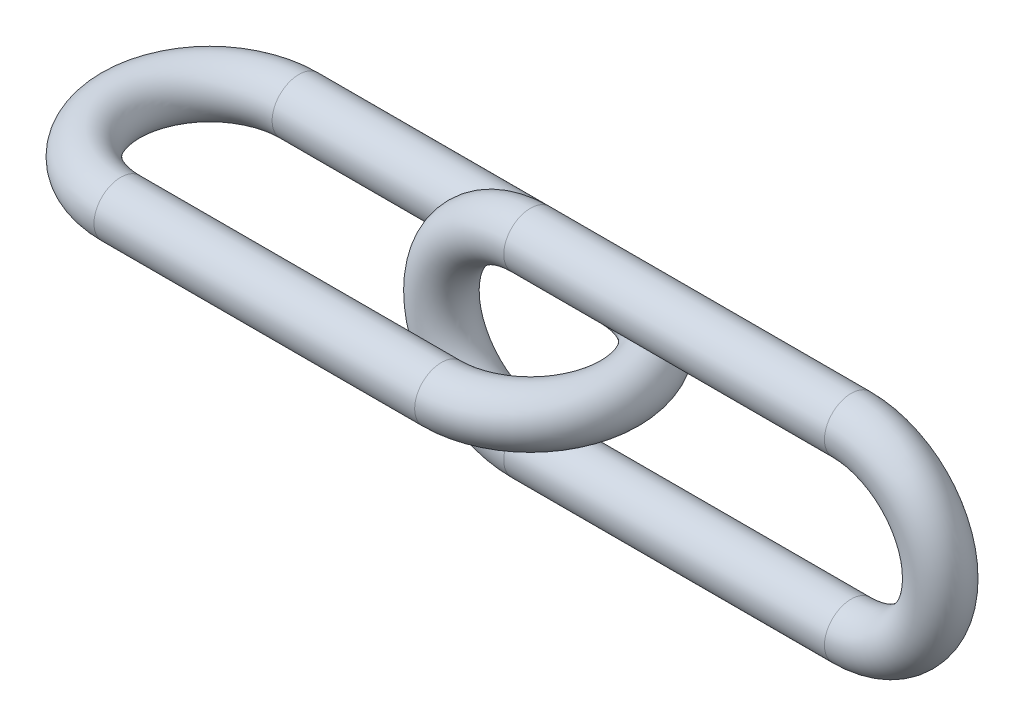
ISO-10303-21;
HEADER;
FILE_DESCRIPTION(('STEP AP214'),'2;1');
FILE_NAME('part.step','',(''),(''),'','','');
FILE_SCHEMA(('AUTOMOTIVE_DESIGN { 1 0 10303 214 1 1 1 1 }'));
ENDSEC;
DATA;
#1=APPLICATION_CONTEXT('core data for automotive mechanical design processes');
#2=APPLICATION_PROTOCOL_DEFINITION('international standard','automotive_design',2000,#1);
#3=PRODUCT_CONTEXT('',#1,'mechanical');
#4=PRODUCT('Part','Part','',(#3));
#5=PRODUCT_RELATED_PRODUCT_CATEGORY('part','',(#4));
#6=PRODUCT_DEFINITION_FORMATION('','',#4);
#7=PRODUCT_DEFINITION_CONTEXT('part definition',#1,'design');
#8=PRODUCT_DEFINITION('design','',#6,#7);
#9=PRODUCT_DEFINITION_SHAPE('','',#8);
#10=(LENGTH_UNIT() NAMED_UNIT(*) SI_UNIT(.MILLI.,.METRE.));
#11=(NAMED_UNIT(*) PLANE_ANGLE_UNIT() SI_UNIT($,.RADIAN.));
#12=(NAMED_UNIT(*) SI_UNIT($,.STERADIAN.) SOLID_ANGLE_UNIT());
#13=UNCERTAINTY_MEASURE_WITH_UNIT(LENGTH_MEASURE(1.E-05),#10,'distance_accuracy_value','');
#14=(GEOMETRIC_REPRESENTATION_CONTEXT(3) GLOBAL_UNCERTAINTY_ASSIGNED_CONTEXT((#13)) GLOBAL_UNIT_ASSIGNED_CONTEXT((#10,
#11,#12)) REPRESENTATION_CONTEXT('',''));
#15=CARTESIAN_POINT('',(0.,0.,0.));
#16=DIRECTION('',(0.,0.,1.));
#17=DIRECTION('',(1.,0.,0.));
#18=AXIS2_PLACEMENT_3D('',#15,#16,#17);
#19=CARTESIAN_POINT('',(-222.426406871193,0.,-50.));
#20=DIRECTION('',(1.,0.,0.));
#21=DIRECTION('',(0.,0.,-1.));
#22=AXIS2_PLACEMENT_3D('',#19,#20,#21);
#23=CYLINDRICAL_SURFACE('',#22,15.);
#24=CARTESIAN_POINT('',(-180.,0.,-50.));
#25=DIRECTION('',(1.,0.,0.));
#26=DIRECTION('',(0.,0.,-1.));
#27=AXIS2_PLACEMENT_3D('',#24,#25,#26);
#28=CIRCLE('',#27,15.);
#29=CARTESIAN_POINT('',(-180.,0.,-65.));
#30=VERTEX_POINT('',#29);
#31=EDGE_CURVE('E11',#30,#30,#28,.F.);
#32=ORIENTED_EDGE('',*,*,#31,.F.);
#33=EDGE_LOOP('',(#32));
#34=FACE_BOUND('',#33,.T.);
#35=CARTESIAN_POINT('',(0.,0.,-50.));
#36=DIRECTION('',(1.,0.,0.));
#37=DIRECTION('',(0.,0.,-1.));
#38=AXIS2_PLACEMENT_3D('',#35,#36,#37);
#39=CIRCLE('',#38,15.);
#40=CARTESIAN_POINT('',(0.,0.,-65.));
#41=VERTEX_POINT('',#40);
#42=EDGE_CURVE('E55',#41,#41,#39,.T.);
#43=ORIENTED_EDGE('',*,*,#42,.F.);
#44=EDGE_LOOP('',(#43));
#45=FACE_BOUND('',#44,.T.);
#46=ADVANCED_FACE('F49',(#34,#45),#23,.T.);
#47=CARTESIAN_POINT('',(-180.,0.,0.));
#48=DIRECTION('',(0.,-1.,0.));
#49=DIRECTION('',(0.,0.,-1.));
#50=AXIS2_PLACEMENT_3D('',#47,#48,#49);
#51=TOROIDAL_SURFACE('',#50,50.,15.);
#52=CARTESIAN_POINT('',(-180.,0.,50.));
#53=DIRECTION('',(1.,0.,0.));
#54=DIRECTION('',(0.,0.,-1.));
#55=AXIS2_PLACEMENT_3D('',#52,#53,#54);
#56=CIRCLE('',#55,15.);
#57=CARTESIAN_POINT('',(-180.,0.,65.));
#58=VERTEX_POINT('',#57);
#59=EDGE_CURVE('E59',#58,#58,#56,.T.);
#60=CARTESIAN_POINT('',(-180.,0.,0.));
#61=DIRECTION('',(0.,-1.,0.));
#62=DIRECTION('',(0.,0.,-1.));
#63=AXIS2_PLACEMENT_3D('',#60,#61,#62);
#64=CIRCLE('',#63,65.);
#65=EDGE_CURVE('',#58,#30,#64,.T.);
#66=ORIENTED_EDGE('',*,*,#59,.F.);
#67=ORIENTED_EDGE('',*,*,#31,.T.);
#68=ORIENTED_EDGE('',*,*,#65,.T.);
#69=ORIENTED_EDGE('',*,*,#65,.F.);
#70=EDGE_LOOP('',(#66,#68,#67,#69));
#71=FACE_BOUND('',#70,.T.);
#72=ADVANCED_FACE('F73',(#71),#51,.T.);
#73=CARTESIAN_POINT('',(42.4264068711929,0.,50.));
#74=DIRECTION('',(-1.,0.,0.));
#75=DIRECTION('',(0.,0.,1.));
#76=AXIS2_PLACEMENT_3D('',#73,#74,#75);
#77=CYLINDRICAL_SURFACE('',#76,15.);
#78=ORIENTED_EDGE('',*,*,#59,.T.);
#79=EDGE_LOOP('',(#78));
#80=FACE_BOUND('',#79,.T.);
#81=CARTESIAN_POINT('',(0.,0.,50.));
#82=DIRECTION('',(1.,0.,0.));
#83=DIRECTION('',(0.,0.,-1.));
#84=AXIS2_PLACEMENT_3D('',#81,#82,#83);
#85=CIRCLE('',#84,15.);
#86=CARTESIAN_POINT('',(0.,0.,65.));
#87=VERTEX_POINT('',#86);
#88=EDGE_CURVE('E63',#87,#87,#85,.T.);
#89=ORIENTED_EDGE('',*,*,#88,.F.);
#90=EDGE_LOOP('',(#89));
#91=FACE_BOUND('',#90,.T.);
#92=ADVANCED_FACE('F71',(#80,#91),#77,.T.);
#93=CARTESIAN_POINT('',(0.,0.,0.));
#94=DIRECTION('',(0.,1.,0.));
#95=DIRECTION('',(0.,0.,1.));
#96=AXIS2_PLACEMENT_3D('',#93,#94,#95);
#97=TOROIDAL_SURFACE('',#96,50.,15.);
#98=CARTESIAN_POINT('',(0.,0.,0.));
#99=DIRECTION('',(0.,1.,0.));
#100=DIRECTION('',(0.,0.,1.));
#101=AXIS2_PLACEMENT_3D('',#98,#99,#100);
#102=CIRCLE('',#101,65.);
#103=EDGE_CURVE('',#87,#41,#102,.T.);
#104=ORIENTED_EDGE('',*,*,#88,.T.);
#105=ORIENTED_EDGE('',*,*,#42,.T.);
#106=ORIENTED_EDGE('',*,*,#103,.T.);
#107=ORIENTED_EDGE('',*,*,#103,.F.);
#108=EDGE_LOOP('',(#104,#106,#105,#107));
#109=FACE_BOUND('',#108,.T.);
#110=ADVANCED_FACE('F69',(#109),#97,.T.);
#111=CLOSED_SHELL('',(#46,#72,#92,#110));
#112=MANIFOLD_SOLID_BREP('B2',#111);
#113=CARTESIAN_POINT('',(-42.4264068711929,50.,0.));
#114=DIRECTION('',(1.,0.,0.));
#115=DIRECTION('',(0.,0.,-1.));
#116=AXIS2_PLACEMENT_3D('',#113,#114,#115);
#117=CYLINDRICAL_SURFACE('',#116,15.);
#118=CARTESIAN_POINT('',(0.,50.,0.));
#119=DIRECTION('',(1.,0.,0.));
#120=DIRECTION('',(0.,0.,-1.));
#121=AXIS2_PLACEMENT_3D('',#118,#119,#120);
#122=CIRCLE('',#121,15.);
#123=CARTESIAN_POINT('',(0.,65.,0.));
#124=VERTEX_POINT('',#123);
#125=EDGE_CURVE('E48',#124,#124,#122,.F.);
#126=ORIENTED_EDGE('',*,*,#125,.F.);
#127=EDGE_LOOP('',(#126));
#128=FACE_BOUND('',#127,.T.);
#129=CARTESIAN_POINT('',(180.,50.,0.));
#130=DIRECTION('',(1.,0.,0.));
#131=DIRECTION('',(0.,0.,-1.));
#132=AXIS2_PLACEMENT_3D('',#129,#130,#131);
#133=CIRCLE('',#132,15.);
#134=CARTESIAN_POINT('',(180.,65.,0.));
#135=VERTEX_POINT('',#134);
#136=EDGE_CURVE('E126',#135,#135,#133,.T.);
#137=ORIENTED_EDGE('',*,*,#136,.F.);
#138=EDGE_LOOP('',(#137));
#139=FACE_BOUND('',#138,.T.);
#140=ADVANCED_FACE('F119',(#128,#139),#117,.T.);
#141=CARTESIAN_POINT('',(180.,0.,0.));
#142=DIRECTION('',(0.,0.,1.));
#143=DIRECTION('',(1.,0.,0.));
#144=AXIS2_PLACEMENT_3D('',#141,#142,#143);
#145=TOROIDAL_SURFACE('',#144,50.,15.);
#146=CARTESIAN_POINT('',(180.,-50.,0.));
#147=DIRECTION('',(-1.,0.,0.));
#148=DIRECTION('',(0.,0.,-1.));
#149=AXIS2_PLACEMENT_3D('',#146,#147,#148);
#150=CIRCLE('',#149,15.);
#151=CARTESIAN_POINT('',(180.,-65.,0.));
#152=VERTEX_POINT('',#151);
#153=EDGE_CURVE('E131',#152,#152,#150,.T.);
#154=CARTESIAN_POINT('',(180.,0.,0.));
#155=DIRECTION('',(0.,0.,1.));
#156=DIRECTION('',(1.,0.,0.));
#157=AXIS2_PLACEMENT_3D('',#154,#155,#156);
#158=CIRCLE('',#157,65.);
#159=EDGE_CURVE('',#152,#135,#158,.T.);
#160=ORIENTED_EDGE('',*,*,#153,.F.);
#161=ORIENTED_EDGE('',*,*,#136,.T.);
#162=ORIENTED_EDGE('',*,*,#159,.T.);
#163=ORIENTED_EDGE('',*,*,#159,.F.);
#164=EDGE_LOOP('',(#160,#162,#161,#163));
#165=FACE_BOUND('',#164,.T.);
#166=ADVANCED_FACE('F152',(#165),#145,.T.);
#167=CARTESIAN_POINT('',(222.426406871193,-50.,0.));
#168=DIRECTION('',(-1.,0.,0.));
#169=DIRECTION('',(0.,0.,1.));
#170=AXIS2_PLACEMENT_3D('',#167,#168,#169);
#171=CYLINDRICAL_SURFACE('',#170,15.);
#172=CARTESIAN_POINT('',(0.,-50.,0.));
#173=DIRECTION('',(1.,0.,0.));
#174=DIRECTION('',(0.,0.,-1.));
#175=AXIS2_PLACEMENT_3D('',#172,#173,#174);
#176=CIRCLE('',#175,15.);
#177=CARTESIAN_POINT('',(0.,-65.,0.));
#178=VERTEX_POINT('',#177);
#179=EDGE_CURVE('E136',#178,#178,#176,.T.);
#180=ORIENTED_EDGE('',*,*,#179,.T.);
#181=EDGE_LOOP('',(#180));
#182=FACE_BOUND('',#181,.T.);
#183=ORIENTED_EDGE('',*,*,#153,.T.);
#184=EDGE_LOOP('',(#183));
#185=FACE_BOUND('',#184,.T.);
#186=ADVANCED_FACE('F143',(#182,#185),#171,.T.);
#187=CARTESIAN_POINT('',(0.,0.,0.));
#188=DIRECTION('',(0.,0.,-1.));
#189=DIRECTION('',(-1.,0.,0.));
#190=AXIS2_PLACEMENT_3D('',#187,#188,#189);
#191=TOROIDAL_SURFACE('',#190,50.,15.);
#192=CARTESIAN_POINT('',(0.,0.,0.));
#193=DIRECTION('',(0.,0.,-1.));
#194=DIRECTION('',(-1.,0.,0.));
#195=AXIS2_PLACEMENT_3D('',#192,#193,#194);
#196=CIRCLE('',#195,65.);
#197=EDGE_CURVE('',#178,#124,#196,.T.);
#198=ORIENTED_EDGE('',*,*,#179,.F.);
#199=ORIENTED_EDGE('',*,*,#125,.T.);
#200=ORIENTED_EDGE('',*,*,#197,.T.);
#201=ORIENTED_EDGE('',*,*,#197,.F.);
#202=EDGE_LOOP('',(#198,#200,#199,#201));
#203=FACE_BOUND('',#202,.T.);
#204=ADVANCED_FACE('F146',(#203),#191,.T.);
#205=CLOSED_SHELL('',(#140,#166,#186,#204));
#206=MANIFOLD_SOLID_BREP('B6',#205);
#207=ADVANCED_BREP_SHAPE_REPRESENTATION('',(#18,#112,#206),#14);
#208=SHAPE_DEFINITION_REPRESENTATION(#9,#207);
ENDSEC;
END-ISO-10303-21;
